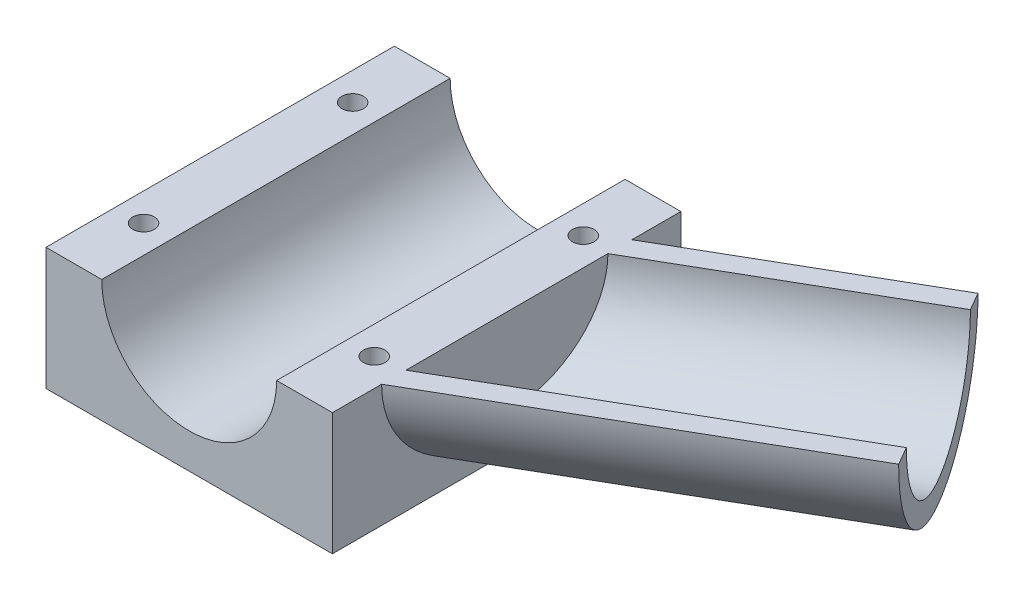
ISO-10303-21;
HEADER;
FILE_DESCRIPTION(('STEP AP214'),'2;1');
FILE_NAME('part.step','',(''),(''),'','','');
FILE_SCHEMA(('AUTOMOTIVE_DESIGN { 1 0 10303 214 1 1 1 1 }'));
ENDSEC;
DATA;
#1=APPLICATION_CONTEXT('core data for automotive mechanical design processes');
#2=APPLICATION_PROTOCOL_DEFINITION('international standard','automotive_design',2000,#1);
#3=PRODUCT_CONTEXT('',#1,'mechanical');
#4=PRODUCT('Part','Part','',(#3));
#5=PRODUCT_RELATED_PRODUCT_CATEGORY('part','',(#4));
#6=PRODUCT_DEFINITION_FORMATION('','',#4);
#7=PRODUCT_DEFINITION_CONTEXT('part definition',#1,'design');
#8=PRODUCT_DEFINITION('design','',#6,#7);
#9=PRODUCT_DEFINITION_SHAPE('','',#8);
#10=(LENGTH_UNIT() NAMED_UNIT(*) SI_UNIT(.MILLI.,.METRE.));
#11=(NAMED_UNIT(*) PLANE_ANGLE_UNIT() SI_UNIT($,.RADIAN.));
#12=(NAMED_UNIT(*) SI_UNIT($,.STERADIAN.) SOLID_ANGLE_UNIT());
#13=UNCERTAINTY_MEASURE_WITH_UNIT(LENGTH_MEASURE(1.E-05),#10,'distance_accuracy_value','');
#14=(GEOMETRIC_REPRESENTATION_CONTEXT(3) GLOBAL_UNCERTAINTY_ASSIGNED_CONTEXT((#13)) GLOBAL_UNIT_ASSIGNED_CONTEXT((#10,
#11,#12)) REPRESENTATION_CONTEXT('',''));
#15=CARTESIAN_POINT('',(0.,0.,0.));
#16=DIRECTION('',(0.,0.,1.));
#17=DIRECTION('',(1.,0.,0.));
#18=AXIS2_PLACEMENT_3D('',#15,#16,#17);
#19=CARTESIAN_POINT('',(20.55,0.,25.));
#20=DIRECTION('',(-1.,0.,0.));
#21=DIRECTION('',(0.,0.,1.));
#22=AXIS2_PLACEMENT_3D('',#19,#20,#21);
#23=PLANE('',#22);
#24=CARTESIAN_POINT('',(20.55,17.55,-0.0231214501151579));
#25=DIRECTION('',(-1.,0.,0.));
#26=DIRECTION('',(0.,0.,-1.));
#27=AXIS2_PLACEMENT_3D('',#24,#25,#26);
#28=ELLIPSE('',#27,17.9555933717974,15.55);
#29=CARTESIAN_POINT('',(20.55,17.55,17.9324719216822));
#30=VERTEX_POINT('',#29);
#31=CARTESIAN_POINT('',(20.55,17.55,-17.9787148219125));
#32=VERTEX_POINT('',#31);
#33=EDGE_CURVE('E137',#30,#32,#28,.F.);
#34=ORIENTED_EDGE('',*,*,#33,.F.);
#35=DIRECTION('',(0.,0.,-1.));
#36=VECTOR('',#35,1.);
#37=CARTESIAN_POINT('',(20.55,17.55,25.));
#38=LINE('',#37,#36);
#39=CARTESIAN_POINT('',(20.55,17.55,25.));
#40=VERTEX_POINT('',#39);
#41=EDGE_CURVE('E123',#40,#30,#38,.T.);
#42=ORIENTED_EDGE('',*,*,#41,.F.);
#43=DIRECTION('',(0.,1.,0.));
#44=VECTOR('',#43,1.);
#45=CARTESIAN_POINT('',(20.55,0.,25.));
#46=LINE('',#45,#44);
#47=CARTESIAN_POINT('',(20.55,0.,25.));
#48=VERTEX_POINT('',#47);
#49=EDGE_CURVE('E191',#48,#40,#46,.T.);
#50=ORIENTED_EDGE('',*,*,#49,.F.);
#51=DIRECTION('',(0.,0.,-1.));
#52=VECTOR('',#51,1.);
#53=CARTESIAN_POINT('',(20.55,0.,25.));
#54=LINE('',#53,#52);
#55=CARTESIAN_POINT('',(20.55,0.,-25.));
#56=VERTEX_POINT('',#55);
#57=EDGE_CURVE('E215',#48,#56,#54,.T.);
#58=ORIENTED_EDGE('',*,*,#57,.T.);
#59=DIRECTION('',(0.,1.,0.));
#60=VECTOR('',#59,1.);
#61=CARTESIAN_POINT('',(20.55,0.,-25.));
#62=LINE('',#61,#60);
#63=CARTESIAN_POINT('',(20.55,17.55,-25.));
#64=VERTEX_POINT('',#63);
#65=EDGE_CURVE('E204',#56,#64,#62,.T.);
#66=ORIENTED_EDGE('',*,*,#65,.T.);
#67=EDGE_CURVE('E58',#32,#64,#38,.T.);
#68=ORIENTED_EDGE('',*,*,#67,.F.);
#69=EDGE_LOOP('',(#34,#42,#50,#58,#66,#68));
#70=FACE_BOUND('',#69,.T.);
#71=ADVANCED_FACE('F37',(#70),#23,.F.);
#72=CARTESIAN_POINT('',(20.55,17.55,-0.0459838096834794));
#73=DIRECTION('',(-1.,0.,0.));
#74=DIRECTION('',(0.,0.,-1.));
#75=AXIS2_PLACEMENT_3D('',#72,#73,#74);
#76=ELLIPSE('',#75,14.4914917566596,12.55);
#77=CARTESIAN_POINT('',(20.55,17.55,-14.5374755663431));
#78=VERTEX_POINT('',#77);
#79=CARTESIAN_POINT('',(20.55,17.55,14.4455079469761));
#80=VERTEX_POINT('',#79);
#81=EDGE_CURVE('E65',#78,#80,#76,.T.);
#82=ORIENTED_EDGE('',*,*,#81,.F.);
#83=EDGE_CURVE('E117',#80,#78,#38,.T.);
#84=ORIENTED_EDGE('',*,*,#83,.F.);
#85=EDGE_LOOP('',(#82,#84));
#86=FACE_BOUND('',#85,.T.);
#87=ADVANCED_FACE('F119',(#86),#23,.F.);
#88=CARTESIAN_POINT('',(-20.55,17.55,25.));
#89=DIRECTION('',(0.,-1.,0.));
#90=DIRECTION('',(0.,0.,-1.));
#91=AXIS2_PLACEMENT_3D('',#88,#89,#90);
#92=PLANE('',#91);
#93=CARTESIAN_POINT('',(-16.55,17.55,15.));
#94=DIRECTION('',(0.,1.,0.));
#95=DIRECTION('',(0.,0.,1.));
#96=AXIS2_PLACEMENT_3D('',#93,#94,#95);
#97=CIRCLE('',#96,1.55);
#98=CARTESIAN_POINT('',(-16.55,17.55,16.55));
#99=VERTEX_POINT('',#98);
#100=EDGE_CURVE('E158',#99,#99,#97,.T.);
#101=ORIENTED_EDGE('',*,*,#100,.F.);
#102=EDGE_LOOP('',(#101));
#103=FACE_BOUND('',#102,.T.);
#104=CARTESIAN_POINT('',(-16.55,17.55,-15.));
#105=DIRECTION('',(0.,1.,0.));
#106=DIRECTION('',(0.,0.,1.));
#107=AXIS2_PLACEMENT_3D('',#104,#105,#106);
#108=CIRCLE('',#107,1.55);
#109=CARTESIAN_POINT('',(-16.55,17.55,-13.45));
#110=VERTEX_POINT('',#109);
#111=EDGE_CURVE('E166',#110,#110,#108,.T.);
#112=ORIENTED_EDGE('',*,*,#111,.F.);
#113=EDGE_LOOP('',(#112));
#114=FACE_BOUND('',#113,.T.);
#115=DIRECTION('',(-1.,0.,0.));
#116=VECTOR('',#115,1.);
#117=CARTESIAN_POINT('',(-20.55,17.55,-25.));
#118=LINE('',#117,#116);
#119=CARTESIAN_POINT('',(-12.55,17.55,-25.));
#120=VERTEX_POINT('',#119);
#121=CARTESIAN_POINT('',(-20.55,17.55,-25.));
#122=VERTEX_POINT('',#121);
#123=EDGE_CURVE('E182',#120,#122,#118,.T.);
#124=ORIENTED_EDGE('',*,*,#123,.T.);
#125=DIRECTION('',(0.,0.,-1.));
#126=VECTOR('',#125,1.);
#127=CARTESIAN_POINT('',(-20.55,17.55,25.));
#128=LINE('',#127,#126);
#129=CARTESIAN_POINT('',(-20.55,17.55,25.));
#130=VERTEX_POINT('',#129);
#131=EDGE_CURVE('E11',#130,#122,#128,.T.);
#132=ORIENTED_EDGE('',*,*,#131,.F.);
#133=DIRECTION('',(-1.,0.,0.));
#134=VECTOR('',#133,1.);
#135=CARTESIAN_POINT('',(-20.55,17.55,25.));
#136=LINE('',#135,#134);
#137=CARTESIAN_POINT('',(-12.55,17.55,25.));
#138=VERTEX_POINT('',#137);
#139=EDGE_CURVE('E183',#138,#130,#136,.T.);
#140=ORIENTED_EDGE('',*,*,#139,.F.);
#141=DIRECTION('',(0.,0.,-1.));
#142=VECTOR('',#141,1.);
#143=CARTESIAN_POINT('',(-12.55,17.55,25.));
#144=LINE('',#143,#142);
#145=EDGE_CURVE('E197',#138,#120,#144,.T.);
#146=ORIENTED_EDGE('',*,*,#145,.T.);
#147=EDGE_LOOP('',(#124,#132,#140,#146));
#148=FACE_BOUND('',#147,.T.);
#149=ADVANCED_FACE('F39',(#103,#114,#148),#92,.F.);
#150=CARTESIAN_POINT('',(-20.55,17.55,25.));
#151=DIRECTION('',(1.,0.,0.));
#152=DIRECTION('',(0.,0.,-1.));
#153=AXIS2_PLACEMENT_3D('',#150,#151,#152);
#154=PLANE('',#153);
#155=DIRECTION('',(0.,-1.,0.));
#156=VECTOR('',#155,1.);
#157=CARTESIAN_POINT('',(-20.55,17.55,-25.));
#158=LINE('',#157,#156);
#159=CARTESIAN_POINT('',(-20.55,0.,-25.));
#160=VERTEX_POINT('',#159);
#161=EDGE_CURVE('E200',#122,#160,#158,.T.);
#162=ORIENTED_EDGE('',*,*,#161,.T.);
#163=DIRECTION('',(0.,0.,-1.));
#164=VECTOR('',#163,1.);
#165=CARTESIAN_POINT('',(-20.55,0.,25.));
#166=LINE('',#165,#164);
#167=CARTESIAN_POINT('',(-20.55,0.,25.));
#168=VERTEX_POINT('',#167);
#169=EDGE_CURVE('E51',#168,#160,#166,.T.);
#170=ORIENTED_EDGE('',*,*,#169,.F.);
#171=DIRECTION('',(0.,-1.,0.));
#172=VECTOR('',#171,1.);
#173=CARTESIAN_POINT('',(-20.55,17.55,25.));
#174=LINE('',#173,#172);
#175=EDGE_CURVE('E186',#130,#168,#174,.T.);
#176=ORIENTED_EDGE('',*,*,#175,.F.);
#177=ORIENTED_EDGE('',*,*,#131,.T.);
#178=EDGE_LOOP('',(#162,#170,#176,#177));
#179=FACE_BOUND('',#178,.T.);
#180=ADVANCED_FACE('F240',(#179),#154,.F.);
#181=CARTESIAN_POINT('',(-20.55,0.,25.));
#182=DIRECTION('',(0.,1.,0.));
#183=DIRECTION('',(0.,0.,1.));
#184=AXIS2_PLACEMENT_3D('',#181,#182,#183);
#185=PLANE('',#184);
#186=CARTESIAN_POINT('',(-16.55,0.,15.));
#187=DIRECTION('',(0.,1.,0.));
#188=DIRECTION('',(0.,0.,1.));
#189=AXIS2_PLACEMENT_3D('',#186,#187,#188);
#190=CIRCLE('',#189,1.55);
#191=CARTESIAN_POINT('',(-16.55,0.,16.55));
#192=VERTEX_POINT('',#191);
#193=EDGE_CURVE('E170',#192,#192,#190,.F.);
#194=ORIENTED_EDGE('',*,*,#193,.F.);
#195=EDGE_LOOP('',(#194));
#196=FACE_BOUND('',#195,.T.);
#197=CARTESIAN_POINT('',(16.55,0.,15.));
#198=DIRECTION('',(0.,1.,0.));
#199=DIRECTION('',(0.,0.,1.));
#200=AXIS2_PLACEMENT_3D('',#197,#198,#199);
#201=CIRCLE('',#200,1.55);
#202=CARTESIAN_POINT('',(16.55,0.,16.55));
#203=VERTEX_POINT('',#202);
#204=EDGE_CURVE('E163',#203,#203,#201,.F.);
#205=ORIENTED_EDGE('',*,*,#204,.F.);
#206=EDGE_LOOP('',(#205));
#207=FACE_BOUND('',#206,.T.);
#208=CARTESIAN_POINT('',(16.55,0.,-15.));
#209=DIRECTION('',(0.,1.,0.));
#210=DIRECTION('',(0.,0.,1.));
#211=AXIS2_PLACEMENT_3D('',#208,#209,#210);
#212=CIRCLE('',#211,1.55);
#213=CARTESIAN_POINT('',(16.55,0.,-13.45));
#214=VERTEX_POINT('',#213);
#215=EDGE_CURVE('E162',#214,#214,#212,.F.);
#216=ORIENTED_EDGE('',*,*,#215,.F.);
#217=EDGE_LOOP('',(#216));
#218=FACE_BOUND('',#217,.T.);
#219=CARTESIAN_POINT('',(-16.55,0.,-15.));
#220=DIRECTION('',(0.,1.,0.));
#221=DIRECTION('',(0.,0.,1.));
#222=AXIS2_PLACEMENT_3D('',#219,#220,#221);
#223=CIRCLE('',#222,1.55);
#224=CARTESIAN_POINT('',(-16.55,0.,-13.45));
#225=VERTEX_POINT('',#224);
#226=EDGE_CURVE('E179',#225,#225,#223,.F.);
#227=ORIENTED_EDGE('',*,*,#226,.F.);
#228=EDGE_LOOP('',(#227));
#229=FACE_BOUND('',#228,.T.);
#230=DIRECTION('',(1.,0.,0.));
#231=VECTOR('',#230,1.);
#232=CARTESIAN_POINT('',(-20.55,0.,-25.));
#233=LINE('',#232,#231);
#234=EDGE_CURVE('E202',#160,#56,#233,.T.);
#235=ORIENTED_EDGE('',*,*,#234,.T.);
#236=ORIENTED_EDGE('',*,*,#57,.F.);
#237=DIRECTION('',(1.,0.,0.));
#238=VECTOR('',#237,1.);
#239=CARTESIAN_POINT('',(-20.55,0.,25.));
#240=LINE('',#239,#238);
#241=EDGE_CURVE('E189',#168,#48,#240,.T.);
#242=ORIENTED_EDGE('',*,*,#241,.F.);
#243=ORIENTED_EDGE('',*,*,#169,.T.);
#244=EDGE_LOOP('',(#235,#236,#242,#243));
#245=FACE_BOUND('',#244,.T.);
#246=ADVANCED_FACE('F223',(#196,#207,#218,#229,#245),#185,.F.);
#247=CARTESIAN_POINT('',(20.55,17.55,25.));
#248=DIRECTION('',(0.,-1.,0.));
#249=DIRECTION('',(0.,0.,-1.));
#250=AXIS2_PLACEMENT_3D('',#247,#248,#249);
#251=PLANE('',#250);
#252=CARTESIAN_POINT('',(16.55,17.55,15.));
#253=DIRECTION('',(0.,1.,0.));
#254=DIRECTION('',(0.,0.,1.));
#255=AXIS2_PLACEMENT_3D('',#252,#253,#254);
#256=CIRCLE('',#255,1.55);
#257=CARTESIAN_POINT('',(16.55,17.55,16.55));
#258=VERTEX_POINT('',#257);
#259=EDGE_CURVE('E167',#258,#258,#256,.T.);
#260=ORIENTED_EDGE('',*,*,#259,.F.);
#261=EDGE_LOOP('',(#260));
#262=FACE_BOUND('',#261,.T.);
#263=CARTESIAN_POINT('',(16.55,17.55,-15.));
#264=DIRECTION('',(0.,1.,0.));
#265=DIRECTION('',(0.,0.,1.));
#266=AXIS2_PLACEMENT_3D('',#263,#264,#265);
#267=CIRCLE('',#266,1.55);
#268=CARTESIAN_POINT('',(16.55,17.55,-13.45));
#269=VERTEX_POINT('',#268);
#270=EDGE_CURVE('E159',#269,#269,#267,.T.);
#271=ORIENTED_EDGE('',*,*,#270,.F.);
#272=EDGE_LOOP('',(#271));
#273=FACE_BOUND('',#272,.T.);
#274=DIRECTION('',(-1.,0.,0.));
#275=VECTOR('',#274,1.);
#276=CARTESIAN_POINT('',(20.55,17.55,-25.));
#277=LINE('',#276,#275);
#278=CARTESIAN_POINT('',(12.55,17.55,-25.));
#279=VERTEX_POINT('',#278);
#280=EDGE_CURVE('E206',#64,#279,#277,.T.);
#281=ORIENTED_EDGE('',*,*,#280,.T.);
#282=DIRECTION('',(0.,0.,-1.));
#283=VECTOR('',#282,1.);
#284=CARTESIAN_POINT('',(12.55,17.55,25.));
#285=LINE('',#284,#283);
#286=CARTESIAN_POINT('',(12.55,17.55,25.));
#287=VERTEX_POINT('',#286);
#288=EDGE_CURVE('E211',#287,#279,#285,.T.);
#289=ORIENTED_EDGE('',*,*,#288,.F.);
#290=DIRECTION('',(-1.,0.,0.));
#291=VECTOR('',#290,1.);
#292=CARTESIAN_POINT('',(20.55,17.55,25.));
#293=LINE('',#292,#291);
#294=EDGE_CURVE('E193',#40,#287,#293,.T.);
#295=ORIENTED_EDGE('',*,*,#294,.F.);
#296=ORIENTED_EDGE('',*,*,#41,.T.);
#297=DIRECTION('',(-0.866025403784438,0.,0.500000000000002));
#298=VECTOR('',#297,1.);
#299=CARTESIAN_POINT('',(67.5873334212851,17.55,-9.22454519105902));
#300=LINE('',#299,#298);
#301=CARTESIAN_POINT('',(67.5873334212851,17.55,-9.22454519105902));
#302=VERTEX_POINT('',#301);
#303=EDGE_CURVE('E134',#302,#30,#300,.T.);
#304=ORIENTED_EDGE('',*,*,#303,.F.);
#305=DIRECTION('',(0.500000000000003,0.,0.866025403784437));
#306=VECTOR('',#305,1.);
#307=CARTESIAN_POINT('',(67.5873334212851,17.55,-9.22454519105902));
#308=LINE('',#307,#306);
#309=CARTESIAN_POINT('',(66.0774337291968,17.55,-11.8397681720886));
#310=VERTEX_POINT('',#309);
#311=EDGE_CURVE('E130',#310,#302,#308,.T.);
#312=ORIENTED_EDGE('',*,*,#311,.F.);
#313=DIRECTION('',(-0.866025403784438,0.,0.500000000000002));
#314=VECTOR('',#313,1.);
#315=CARTESIAN_POINT('',(66.0774337291968,17.55,-11.8397681720886));
#316=LINE('',#315,#314);
#317=EDGE_CURVE('E127',#310,#80,#316,.T.);
#318=ORIENTED_EDGE('',*,*,#317,.T.);
#319=ORIENTED_EDGE('',*,*,#83,.T.);
#320=DIRECTION('',(-0.866025403784438,0.,0.500000000000002));
#321=VECTOR('',#320,1.);
#322=CARTESIAN_POINT('',(53.5274337291967,17.55,-33.577005807078));
#323=LINE('',#322,#321);
#324=CARTESIAN_POINT('',(53.5274337291967,17.55,-33.577005807078));
#325=VERTEX_POINT('',#324);
#326=EDGE_CURVE('E133',#325,#78,#323,.T.);
#327=ORIENTED_EDGE('',*,*,#326,.F.);
#328=DIRECTION('',(0.500000000000002,0.,0.866025403784438));
#329=VECTOR('',#328,1.);
#330=CARTESIAN_POINT('',(53.5274337291967,17.55,-33.577005807078));
#331=LINE('',#330,#329);
#332=CARTESIAN_POINT('',(52.037333421285,17.55,-36.157935248755));
#333=VERTEX_POINT('',#332);
#334=EDGE_CURVE('E148',#333,#325,#331,.T.);
#335=ORIENTED_EDGE('',*,*,#334,.F.);
#336=DIRECTION('',(-0.866025403784438,0.,0.500000000000002));
#337=VECTOR('',#336,1.);
#338=CARTESIAN_POINT('',(52.037333421285,17.55,-36.157935248755));
#339=LINE('',#338,#337);
#340=EDGE_CURVE('E156',#333,#32,#339,.T.);
#341=ORIENTED_EDGE('',*,*,#340,.T.);
#342=ORIENTED_EDGE('',*,*,#67,.T.);
#343=EDGE_LOOP('',(#281,#289,#295,#296,#304,#312,#318,#319,#327,#335,#341,#342));
#344=FACE_BOUND('',#343,.T.);
#345=ADVANCED_FACE('F128',(#262,#273,#344),#251,.F.);
#346=CARTESIAN_POINT('',(0.,17.55,25.));
#347=DIRECTION('',(0.,0.,-1.));
#348=DIRECTION('',(-1.,0.,0.));
#349=AXIS2_PLACEMENT_3D('',#346,#347,#348);
#350=CYLINDRICAL_SURFACE('',#349,12.55);
#351=CARTESIAN_POINT('',(0.,17.55,-25.));
#352=DIRECTION('',(0.,0.,-1.));
#353=DIRECTION('',(1.,0.,0.));
#354=AXIS2_PLACEMENT_3D('',#351,#352,#353);
#355=CIRCLE('',#354,12.55);
#356=EDGE_CURVE('E187',#279,#120,#355,.T.);
#357=ORIENTED_EDGE('',*,*,#356,.T.);
#358=ORIENTED_EDGE('',*,*,#145,.F.);
#359=CARTESIAN_POINT('',(0.,17.55,25.));
#360=DIRECTION('',(0.,0.,-1.));
#361=DIRECTION('',(1.,0.,0.));
#362=AXIS2_PLACEMENT_3D('',#359,#360,#361);
#363=CIRCLE('',#362,12.55);
#364=EDGE_CURVE('E195',#287,#138,#363,.T.);
#365=ORIENTED_EDGE('',*,*,#364,.F.);
#366=ORIENTED_EDGE('',*,*,#288,.T.);
#367=EDGE_LOOP('',(#357,#358,#365,#366));
#368=FACE_BOUND('',#367,.T.);
#369=ADVANCED_FACE('F244',(#368),#350,.F.);
#370=CARTESIAN_POINT('',(0.,17.55,25.));
#371=DIRECTION('',(0.,0.,1.));
#372=DIRECTION('',(1.,0.,0.));
#373=AXIS2_PLACEMENT_3D('',#370,#371,#372);
#374=PLANE('',#373);
#375=ORIENTED_EDGE('',*,*,#139,.T.);
#376=ORIENTED_EDGE('',*,*,#175,.T.);
#377=ORIENTED_EDGE('',*,*,#241,.T.);
#378=ORIENTED_EDGE('',*,*,#49,.T.);
#379=ORIENTED_EDGE('',*,*,#294,.T.);
#380=ORIENTED_EDGE('',*,*,#364,.T.);
#381=EDGE_LOOP('',(#375,#376,#377,#378,#379,#380));
#382=FACE_BOUND('',#381,.T.);
#383=ADVANCED_FACE('F236',(#382),#374,.T.);
#384=CARTESIAN_POINT('',(0.,17.55,-25.));
#385=DIRECTION('',(0.,0.,1.));
#386=DIRECTION('',(1.,0.,0.));
#387=AXIS2_PLACEMENT_3D('',#384,#385,#386);
#388=PLANE('',#387);
#389=ORIENTED_EDGE('',*,*,#123,.F.);
#390=ORIENTED_EDGE('',*,*,#356,.F.);
#391=ORIENTED_EDGE('',*,*,#280,.F.);
#392=ORIENTED_EDGE('',*,*,#65,.F.);
#393=ORIENTED_EDGE('',*,*,#234,.F.);
#394=ORIENTED_EDGE('',*,*,#161,.F.);
#395=EDGE_LOOP('',(#389,#390,#391,#392,#393,#394));
#396=FACE_BOUND('',#395,.T.);
#397=ADVANCED_FACE('F229',(#396),#388,.F.);
#398=CARTESIAN_POINT('',(16.55,-4.38406204335659,-15.));
#399=DIRECTION('',(0.,1.,0.));
#400=DIRECTION('',(0.,0.,1.));
#401=AXIS2_PLACEMENT_3D('',#398,#399,#400);
#402=CYLINDRICAL_SURFACE('',#401,1.55);
#403=ORIENTED_EDGE('',*,*,#215,.T.);
#404=EDGE_LOOP('',(#403));
#405=FACE_BOUND('',#404,.T.);
#406=ORIENTED_EDGE('',*,*,#270,.T.);
#407=EDGE_LOOP('',(#406));
#408=FACE_BOUND('',#407,.T.);
#409=ADVANCED_FACE('F295',(#405,#408),#402,.F.);
#410=CARTESIAN_POINT('',(16.55,-4.38406204335659,15.));
#411=DIRECTION('',(0.,1.,0.));
#412=DIRECTION('',(0.,0.,1.));
#413=AXIS2_PLACEMENT_3D('',#410,#411,#412);
#414=CYLINDRICAL_SURFACE('',#413,1.55);
#415=ORIENTED_EDGE('',*,*,#204,.T.);
#416=EDGE_LOOP('',(#415));
#417=FACE_BOUND('',#416,.T.);
#418=ORIENTED_EDGE('',*,*,#259,.T.);
#419=EDGE_LOOP('',(#418));
#420=FACE_BOUND('',#419,.T.);
#421=ADVANCED_FACE('F286',(#417,#420),#414,.F.);
#422=CARTESIAN_POINT('',(-16.55,-4.38406204335659,-15.));
#423=DIRECTION('',(0.,1.,0.));
#424=DIRECTION('',(0.,0.,1.));
#425=AXIS2_PLACEMENT_3D('',#422,#423,#424);
#426=CYLINDRICAL_SURFACE('',#425,1.55);
#427=ORIENTED_EDGE('',*,*,#226,.T.);
#428=EDGE_LOOP('',(#427));
#429=FACE_BOUND('',#428,.T.);
#430=ORIENTED_EDGE('',*,*,#111,.T.);
#431=EDGE_LOOP('',(#430));
#432=FACE_BOUND('',#431,.T.);
#433=ADVANCED_FACE('F283',(#429,#432),#426,.F.);
#434=CARTESIAN_POINT('',(-16.55,-4.38406204335659,15.));
#435=DIRECTION('',(0.,1.,0.));
#436=DIRECTION('',(0.,0.,1.));
#437=AXIS2_PLACEMENT_3D('',#434,#435,#436);
#438=CYLINDRICAL_SURFACE('',#437,1.55);
#439=ORIENTED_EDGE('',*,*,#193,.T.);
#440=EDGE_LOOP('',(#439));
#441=FACE_BOUND('',#440,.T.);
#442=ORIENTED_EDGE('',*,*,#100,.T.);
#443=EDGE_LOOP('',(#442));
#444=FACE_BOUND('',#443,.T.);
#445=ADVANCED_FACE('F285',(#441,#444),#438,.F.);
#446=CARTESIAN_POINT('',(59.8123334212851,17.55,-22.691240219907));
#447=DIRECTION('',(-0.866025403784438,0.,0.500000000000002));
#448=DIRECTION('',(0.500000000000002,0.,0.866025403784438));
#449=AXIS2_PLACEMENT_3D('',#446,#447,#448);
#450=CYLINDRICAL_SURFACE('',#449,15.55);
#451=CARTESIAN_POINT('',(45.2620526724303,2.02032537562642,-15.2083869895832));
#452=CARTESIAN_POINT('',(45.26205633923,2.02418920013468,-15.2955543585492));
#453=CARTESIAN_POINT('',(45.2694294611896,2.02842133952335,-15.3827638264494));
#454=CARTESIAN_POINT('',(45.2987275859641,2.03715527343421,-15.5547596411649));
#455=CARTESIAN_POINT('',(45.320669215916,2.04165737071416,-15.6395431037018));
#456=CARTESIAN_POINT('',(45.3784857389402,2.05042521763832,-15.8041998234869));
#457=CARTESIAN_POINT('',(45.4143547361554,2.05469106642138,-15.8840751419439));
#458=CARTESIAN_POINT('',(45.4990163959288,2.06251023798173,-16.0366669312086));
#459=CARTESIAN_POINT('',(45.5478058215561,2.066063738831,-16.1093851888114));
#460=CARTESIAN_POINT('',(45.6568844393027,2.07205617181064,-16.2455401418695));
#461=CARTESIAN_POINT('',(45.7171611900976,2.07449630016045,-16.3089867488132));
#462=CARTESIAN_POINT('',(45.8475424392882,2.07799123976775,-16.4248682764751));
#463=CARTESIAN_POINT('',(45.9176470023308,2.07904604191214,-16.4773031247528));
#464=CARTESIAN_POINT('',(46.0653353110408,2.07964892079179,-16.5694357502168));
#465=CARTESIAN_POINT('',(46.1428833138642,2.07920387945623,-16.6091907899252));
#466=CARTESIAN_POINT('',(46.3035171885947,2.07687258795515,-16.6751625349934));
#467=CARTESIAN_POINT('',(46.3866030222516,2.07498634774313,-16.7013793338515));
#468=CARTESIAN_POINT('',(46.5558813807299,2.06998696111358,-16.7395297111124));
#469=CARTESIAN_POINT('',(46.6420712788488,2.0668748308818,-16.7514750866357));
#470=CARTESIAN_POINT('',(46.8151996037612,2.0597707701028,-16.7608063246381));
#471=CARTESIAN_POINT('',(46.9021380501555,2.0557788164495,-16.7581918046986));
#472=CARTESIAN_POINT('',(47.074698757268,2.04733923147732,-16.7384491596381));
#473=CARTESIAN_POINT('',(47.1603139774713,2.04288976107674,-16.7212602726879));
#474=CARTESIAN_POINT('',(47.3274559893531,2.03404225005765,-16.6727747667112));
#475=CARTESIAN_POINT('',(47.4089827009646,2.02964421044763,-16.6414778715214));
#476=CARTESIAN_POINT('',(47.5658740961401,2.02137355837333,-16.5655417185064));
#477=CARTESIAN_POINT('',(47.6412213007677,2.01750241717708,-16.5208661716332));
#478=CARTESIAN_POINT('',(47.7833581555217,2.01072812986431,-16.419455503554));
#479=CARTESIAN_POINT('',(47.8501479817816,2.00782496382234,-16.3627206306249));
#480=CARTESIAN_POINT('',(47.9730748860649,2.00331238887912,-16.2389748994778));
#481=CARTESIAN_POINT('',(48.0292420784958,2.0016992794708,-16.1719940947776));
#482=CARTESIAN_POINT('',(48.1295458582882,1.99992561866639,-16.0295443389379));
#483=CARTESIAN_POINT('',(48.1736827657671,1.99976502861614,-15.9540756137314));
#484=CARTESIAN_POINT('',(48.2485127476051,2.00090273252432,-15.7971239067418));
#485=CARTESIAN_POINT('',(48.2792584096193,2.00219524712129,-15.7156659462017));
#486=CARTESIAN_POINT('',(48.3266988728493,2.00607592957498,-15.5487866408029));
#487=CARTESIAN_POINT('',(48.3433935708379,2.00866410695022,-15.4633652668311));
#488=CARTESIAN_POINT('',(48.3622881240329,2.01484175945325,-15.2908805005466));
#489=CARTESIAN_POINT('',(48.3644727254458,2.01843228417331,-15.2038154767009));
#490=CARTESIAN_POINT('',(48.3542625937158,2.02620509148809,-15.0305706679314));
#491=CARTESIAN_POINT('',(48.3418674300385,2.03038739155448,-14.9443909092248));
#492=CARTESIAN_POINT('',(48.3027654905743,2.03888935083903,-14.7749496997556));
#493=CARTESIAN_POINT('',(48.2759964137134,2.04320953041959,-14.6917026467407));
#494=CARTESIAN_POINT('',(48.2088561168276,2.05147738253638,-14.5308663501793));
#495=CARTESIAN_POINT('',(48.1684848168053,2.05542505288163,-14.453277139911));
#496=CARTESIAN_POINT('',(48.0752240510177,2.0624996937119,-14.3058848858825));
#497=CARTESIAN_POINT('',(48.0223234207427,2.06562592696795,-14.2360888684919));
#498=CARTESIAN_POINT('',(47.9055145794632,2.07069280570708,-14.1063621240779));
#499=CARTESIAN_POINT('',(47.8416066738892,2.0726334840802,-14.0464311234095));
#500=CARTESIAN_POINT('',(47.7048766518706,2.07509973809678,-13.938375952648));
#501=CARTESIAN_POINT('',(47.6320909147884,2.07563089854094,-13.8902058748115));
#502=CARTESIAN_POINT('',(47.4794813779933,2.07523303172739,-13.8067441985018));
#503=CARTESIAN_POINT('',(47.3996577031549,2.07430403037247,-13.7714523715863));
#504=CARTESIAN_POINT('',(47.2354636518955,2.0710971040048,-13.7148188051653));
#505=CARTESIAN_POINT('',(47.1511054637703,2.06882264531954,-13.6934415135775));
#506=CARTESIAN_POINT('',(46.9800389004152,2.06318733953494,-13.6650794621736));
#507=CARTESIAN_POINT('',(46.8933304747999,2.05982646912766,-13.658095011166));
#508=CARTESIAN_POINT('',(46.719745327022,2.05238908084308,-13.6586985790262));
#509=CARTESIAN_POINT('',(46.6328688405295,2.04831052731975,-13.6663286761189));
#510=CARTESIAN_POINT('',(46.4616289582495,2.03990752430941,-13.6960196864783));
#511=CARTESIAN_POINT('',(46.3772656311442,2.03558306811148,-13.7180809937589));
#512=CARTESIAN_POINT('',(46.2130970745756,2.02716228400729,-13.7761296818276));
#513=CARTESIAN_POINT('',(46.1333104451991,2.02306688850128,-13.812169824805));
#514=CARTESIAN_POINT('',(45.9809060872675,2.01559098038745,-13.8971633379723));
#515=CARTESIAN_POINT('',(45.9082880433248,2.0122104363217,-13.9461161397115));
#516=CARTESIAN_POINT('',(45.7723816788033,2.00655750567297,-14.0554853831176));
#517=CARTESIAN_POINT('',(45.7090808382724,2.00428362235889,-14.1158861870651));
#518=CARTESIAN_POINT('',(45.5934973822479,2.00110266626072,-14.2464993646975));
#519=CARTESIAN_POINT('',(45.5412169151704,2.00019585977598,-14.3167136470862));
#520=CARTESIAN_POINT('',(45.4493789036508,1.99986195776657,-14.4646314383319));
#521=CARTESIAN_POINT('',(45.4097722280463,2.00042906845342,-14.5423044708651));
#522=CARTESIAN_POINT('',(45.3441577869512,2.00297682639485,-14.7031055164233));
#523=CARTESIAN_POINT('',(45.3181351356333,2.00495592069588,-14.786227445415));
#524=CARTESIAN_POINT('',(45.2868900545203,2.00921587656138,-14.9262414887749));
#525=CARTESIAN_POINT('',(45.2775869500217,2.0111559188965,-14.9822678532798));
#526=CARTESIAN_POINT('',(45.2651670686679,2.01545380240391,-15.0949858691935));
#527=CARTESIAN_POINT('',(45.2620502868786,2.01781164324297,-15.1516775200716));
#528=CARTESIAN_POINT('',(45.2620526724303,2.02032537562642,-15.2083869895832));
#529=B_SPLINE_CURVE_WITH_KNOTS('',3,(#451,#452,#453,#454,#455,#456,#457,#458,#459,#460,#461,
#462,#463,#464,#465,#466,#467,#468,#469,#470,#471,#472,#473,#474,#475,#476,#477,#478,#479,#480,
#481,#482,#483,#484,#485,#486,#487,#488,#489,#490,#491,#492,#493,#494,#495,#496,#497,#498,#499,
#500,#501,#502,#503,#504,#505,#506,#507,#508,#509,#510,#511,#512,#513,#514,#515,#516,#517,#518,
#519,#520,#521,#522,#523,#524,#525,#526,#527,#528),.UNSPECIFIED.,.T.,.F.,(4,2,2,2,2,2,2,2,2,2,2,
2,2,2,2,2,2,2,2,2,2,2,2,2,2,2,2,2,2,2,2,2,2,2,2,2,2,2,4),(0.,0.261552015165669,0.52340305571867,
0.785143367799772,1.04681816849996,1.30821115708327,1.56960586518008,1.82980281756388,
2.08999797294105,2.34997789525659,2.60996464602878,2.87104066457713,3.13212179389415,
3.39391761033022,3.65570803744858,3.91674480199317,4.17777461985573,4.43776991812374,
4.69776712646351,4.95803761464495,5.21831578869793,5.47973130577198,5.74114836030991,
6.00279923796598,6.26444285648673,6.5250482303022,6.78564898111388,7.04558124745135,
7.30551909076097,7.56620647258639,7.82690097223156,8.08858917445787,8.35026585837097,
8.61158764072427,8.87296032060531,9.1333071317301,9.39336804402122,9.56352905766541,
9.73368993559139),.UNSPECIFIED.);
#530=CARTESIAN_POINT('',(45.2620526724303,2.02032537562642,-15.2083869895832));
#531=VERTEX_POINT('',#530);
#532=EDGE_CURVE('E143',#531,#531,#529,.T.);
#533=ORIENTED_EDGE('',*,*,#532,.F.);
#534=EDGE_LOOP('',(#533));
#535=FACE_BOUND('',#534,.T.);
#536=ORIENTED_EDGE('',*,*,#303,.T.);
#537=ORIENTED_EDGE('',*,*,#33,.T.);
#538=ORIENTED_EDGE('',*,*,#340,.F.);
#539=CARTESIAN_POINT('',(59.8123334212851,17.55,-22.691240219907));
#540=DIRECTION('',(0.866025403784438,0.,-0.500000000000002));
#541=DIRECTION('',(-0.500000000000002,0.,-0.866025403784438));
#542=AXIS2_PLACEMENT_3D('',#539,#540,#541);
#543=CIRCLE('',#542,15.55);
#544=EDGE_CURVE('E140',#302,#333,#543,.T.);
#545=ORIENTED_EDGE('',*,*,#544,.F.);
#546=EDGE_LOOP('',(#536,#537,#538,#545));
#547=FACE_BOUND('',#546,.T.);
#548=ADVANCED_FACE('F249',(#535,#547),#450,.T.);
#549=CARTESIAN_POINT('',(59.8024337291967,17.55,-22.7083869895833));
#550=DIRECTION('',(-0.866025403784438,0.,0.500000000000002));
#551=DIRECTION('',(0.500000000000002,0.,0.866025403784438));
#552=AXIS2_PLACEMENT_3D('',#549,#550,#551);
#553=CYLINDRICAL_SURFACE('',#552,12.55);
#554=CARTESIAN_POINT('',(45.2620526724303,5.02395213964116,-15.2083869895832));
#555=CARTESIAN_POINT('',(45.2620562306795,5.02862588513992,-15.2956056025853));
#556=CARTESIAN_POINT('',(45.2694376721673,5.03376281884102,-15.3828553056006));
#557=CARTESIAN_POINT('',(45.2987620580694,5.04438757749893,-15.5549185786391));
#558=CARTESIAN_POINT('',(45.3207211643577,5.04987578579555,-15.6397293356619));
#559=CARTESIAN_POINT('',(45.3785841108097,5.06057877333543,-15.8044416243056));
#560=CARTESIAN_POINT('',(45.4144823737209,5.06579366099214,-15.8843451046064));
#561=CARTESIAN_POINT('',(45.4992219808785,5.07536023221266,-16.0369974081047));
#562=CARTESIAN_POINT('',(45.5480600797323,5.07971213174149,-16.109748019023));
#563=CARTESIAN_POINT('',(45.6572339688523,5.08705103095026,-16.2459307887705));
#564=CARTESIAN_POINT('',(45.7175513211033,5.09004019367019,-16.3093776059205));
#565=CARTESIAN_POINT('',(45.8480280380999,5.09431945210512,-16.4252554643872));
#566=CARTESIAN_POINT('',(45.9181873006532,5.09560956546055,-16.4776866200695));
#567=CARTESIAN_POINT('',(46.0658189150392,5.09633875538956,-16.5696909402348));
#568=CARTESIAN_POINT('',(46.1432376975621,5.09579049148098,-16.6093499895847));
#569=CARTESIAN_POINT('',(46.3035812013139,5.0929337998893,-16.6751751336146));
#570=CARTESIAN_POINT('',(46.3865058737668,5.09062538779724,-16.701341347808));
#571=CARTESIAN_POINT('',(46.5553982930167,5.08451539902752,-16.7394368580348));
#572=CARTESIAN_POINT('',(46.6413621279061,5.08071568249361,-16.7513838155523));
#573=CARTESIAN_POINT('',(46.8140256931061,5.07205096796909,-16.7607955324157));
#574=CARTESIAN_POINT('',(46.9007254528085,5.0671859272364,-16.7582597105928));
#575=CARTESIAN_POINT('',(47.0730049020705,5.05690046123178,-16.7387354696722));
#576=CARTESIAN_POINT('',(47.158574076864,5.05147672628877,-16.7216559877165));
#577=CARTESIAN_POINT('',(47.3256497986765,5.04070685372135,-16.6734054378192));
#578=CARTESIAN_POINT('',(47.4071562293868,5.03536071832157,-16.6422339667075));
#579=CARTESIAN_POINT('',(47.5641482097429,5.02532260928598,-16.566502533584));
#580=CARTESIAN_POINT('',(47.6396080929717,5.02063336694709,-16.5218889677444));
#581=CARTESIAN_POINT('',(47.7819854515185,5.01246363037328,-16.4205604007453));
#582=CARTESIAN_POINT('',(47.8489031994974,5.00898309755081,-16.3638457860001));
#583=CARTESIAN_POINT('',(47.9719886784379,5.0036366391157,-16.2401933988949));
#584=CARTESIAN_POINT('',(48.0282028934171,5.00176360185631,-16.173302212654));
#585=CARTESIAN_POINT('',(48.1286219194411,4.99981725935061,-16.0310209536608));
#586=CARTESIAN_POINT('',(48.1728272122494,4.99974388189656,-15.9556312220176));
#587=CARTESIAN_POINT('',(48.2477334875783,5.00139989230297,-15.7989909210668));
#588=CARTESIAN_POINT('',(48.278513261963,5.00311855544731,-15.7177778959547));
#589=CARTESIAN_POINT('',(48.3260955357483,5.00815033819041,-15.551403947766));
#590=CARTESIAN_POINT('',(48.3428978689338,5.01146347674938,-15.4662429777544));
#591=CARTESIAN_POINT('',(48.362096615257,5.01932342575854,-15.2942200107288));
#592=CARTESIAN_POINT('',(48.3644678242401,5.02387238011626,-15.2073553033171));
#593=CARTESIAN_POINT('',(48.3546979007977,5.03369740247235,-15.0344865658041));
#594=CARTESIAN_POINT('',(48.3425561079401,5.03897350355076,-14.9484825750504));
#595=CARTESIAN_POINT('',(48.3039768144937,5.04970552155195,-14.7791383906025));
#596=CARTESIAN_POINT('',(48.2774432192928,5.05516241300512,-14.69582013719));
#597=CARTESIAN_POINT('',(48.2107540032032,5.06560850167963,-14.5347929268964));
#598=CARTESIAN_POINT('',(48.1705982528853,5.07059769445661,-14.4570840233204));
#599=CARTESIAN_POINT('',(48.0777099513575,5.07954945249466,-14.3093689672875));
#600=CARTESIAN_POINT('',(48.0249604889864,5.08351062224329,-14.2393733587634));
#601=CARTESIAN_POINT('',(47.9083941675875,5.08994271635595,-14.109220837013));
#602=CARTESIAN_POINT('',(47.8445778011243,5.09241370702277,-14.0490634861381));
#603=CARTESIAN_POINT('',(47.70812847149,5.09556962455155,-13.9406755204393));
#604=CARTESIAN_POINT('',(47.6355531277957,5.09626562197348,-13.8923726867717));
#605=CARTESIAN_POINT('',(47.4833474978984,5.0958236689966,-13.8085980836888));
#606=CARTESIAN_POINT('',(47.403717405678,5.0946857690092,-13.7731259616071));
#607=CARTESIAN_POINT('',(47.2400220408549,5.09071518345367,-13.7161326170163));
#608=CARTESIAN_POINT('',(47.1559762742663,5.0878894600051,-13.6945548372305));
#609=CARTESIAN_POINT('',(46.9855207535789,5.08086910406365,-13.6657005592316));
#610=CARTESIAN_POINT('',(46.8991109244454,5.07667442807425,-13.6584245154872));
#611=CARTESIAN_POINT('',(46.7259478737368,5.06736555043465,-13.6583495860293));
#612=CARTESIAN_POINT('',(46.6391948462531,5.0622473171664,-13.6656156435348));
#613=CARTESIAN_POINT('',(46.4681401156552,5.05167704435951,-13.6945346474172));
#614=CARTESIAN_POINT('',(46.3838385160979,5.04622499074922,-13.7161882006541));
#615=CARTESIAN_POINT('',(46.2195219866855,5.03556134690064,-13.7734574520401));
#616=CARTESIAN_POINT('',(46.1395362359559,5.03035142021361,-13.8091572391822));
#617=CARTESIAN_POINT('',(45.9866693980186,5.02079382969938,-13.8935245425488));
#618=CARTESIAN_POINT('',(45.913787990277,5.01644612696118,-13.9421914733513));
#619=CARTESIAN_POINT('',(45.7773353179898,5.00910959983394,-14.0510354211277));
#620=CARTESIAN_POINT('',(45.7137472594786,5.00611830318681,-14.1111912110475));
#621=CARTESIAN_POINT('',(45.5975501247391,5.00182061113483,-14.2413833260007));
#622=CARTESIAN_POINT('',(45.5449428700771,5.00051449509264,-14.3114212871273));
#623=CARTESIAN_POINT('',(45.4525466871866,4.9997379937178,-14.4588747032595));
#624=CARTESIAN_POINT('',(45.412678552127,5.00025601438464,-14.5362405335314));
#625=CARTESIAN_POINT('',(45.3464699514407,5.00304468867727,-14.6964632108894));
#626=CARTESIAN_POINT('',(45.3201153912128,5.0053135100111,-14.7793142346528));
#627=CARTESIAN_POINT('',(45.2879695643847,5.01034476129735,-14.920221730836));
#628=CARTESIAN_POINT('',(45.278261725609,5.01269678704527,-14.9774313408132));
#629=CARTESIAN_POINT('',(45.2653020981554,5.01794848917555,-15.0925517261263));
#630=CARTESIAN_POINT('',(45.2620503092906,5.02084816554205,-15.1504625014418));
#631=CARTESIAN_POINT('',(45.2620526724303,5.02395213964116,-15.2083869895832));
#632=B_SPLINE_CURVE_WITH_KNOTS('',3,(#554,#555,#556,#557,#558,#559,#560,#561,#562,#563,#564,
#565,#566,#567,#568,#569,#570,#571,#572,#573,#574,#575,#576,#577,#578,#579,#580,#581,#582,#583,
#584,#585,#586,#587,#588,#589,#590,#591,#592,#593,#594,#595,#596,#597,#598,#599,#600,#601,#602,
#603,#604,#605,#606,#607,#608,#609,#610,#611,#612,#613,#614,#615,#616,#617,#618,#619,#620,#621,
#622,#623,#624,#625,#626,#627,#628,#629,#630,#631),.UNSPECIFIED.,.T.,.F.,(4,2,2,2,2,2,2,2,2,2,2,
2,2,2,2,2,2,2,2,2,2,2,2,2,2,2,2,2,2,2,2,2,2,2,2,2,2,2,4),(0.,0.26181995864289,0.523930676053048,
0.785936627166148,1.04787692763069,1.30939999633542,1.57092034974789,1.83064351847476,
2.09036438665188,2.34976232240677,2.60917066742304,2.87021530230309,3.13126740611214,
3.39337461932611,3.65547346410784,3.91640670255883,4.17732947157026,4.43669962554222,
4.69607286381479,4.95589897127883,5.2157369029016,5.47733153161307,5.73892864590185,
6.00087903512879,6.26281776848898,6.52311876031197,6.7834125969263,7.04264008867138,
7.30187581780295,7.56227184483132,7.82267885597908,8.08466913426139,8.34664758658675,
8.60814660454693,8.86968896722424,9.12957200576332,9.38918343320791,9.5630658994221,
9.73694836060322),.UNSPECIFIED.);
#633=CARTESIAN_POINT('',(45.2620526724303,5.02395213964116,-15.2083869895832));
#634=VERTEX_POINT('',#633);
#635=EDGE_CURVE('E41',#634,#634,#632,.T.);
#636=ORIENTED_EDGE('',*,*,#635,.T.);
#637=EDGE_LOOP('',(#636));
#638=FACE_BOUND('',#637,.T.);
#639=ORIENTED_EDGE('',*,*,#326,.T.);
#640=ORIENTED_EDGE('',*,*,#81,.T.);
#641=ORIENTED_EDGE('',*,*,#317,.F.);
#642=CARTESIAN_POINT('',(59.8024337291967,17.55,-22.7083869895833));
#643=DIRECTION('',(-0.866025403784438,0.,0.500000000000002));
#644=DIRECTION('',(-0.500000000000002,0.,-0.866025403784438));
#645=AXIS2_PLACEMENT_3D('',#642,#643,#644);
#646=CIRCLE('',#645,12.55);
#647=EDGE_CURVE('E150',#325,#310,#646,.T.);
#648=ORIENTED_EDGE('',*,*,#647,.F.);
#649=EDGE_LOOP('',(#639,#640,#641,#648));
#650=FACE_BOUND('',#649,.T.);
#651=ADVANCED_FACE('F136',(#638,#650),#553,.F.);
#652=CARTESIAN_POINT('',(59.8123334212851,17.55,-22.691240219907));
#653=DIRECTION('',(0.866025403784438,0.,-0.500000000000002));
#654=DIRECTION('',(-0.500000000000002,0.,-0.866025403784438));
#655=AXIS2_PLACEMENT_3D('',#652,#653,#654);
#656=PLANE('',#655);
#657=ORIENTED_EDGE('',*,*,#544,.T.);
#658=ORIENTED_EDGE('',*,*,#334,.T.);
#659=ORIENTED_EDGE('',*,*,#647,.T.);
#660=ORIENTED_EDGE('',*,*,#311,.T.);
#661=EDGE_LOOP('',(#657,#658,#659,#660));
#662=FACE_BOUND('',#661,.T.);
#663=ADVANCED_FACE('F251',(#662),#656,.T.);
#664=CARTESIAN_POINT('',(46.8120526724303,-0.00100000000003569,-15.2083869895832));
#665=DIRECTION('',(0.,1.,0.));
#666=DIRECTION('',(-1.,0.,0.));
#667=AXIS2_PLACEMENT_3D('',#664,#665,#666);
#668=CYLINDRICAL_SURFACE('',#667,1.55);
#669=ORIENTED_EDGE('',*,*,#532,.T.);
#670=EDGE_LOOP('',(#669));
#671=FACE_BOUND('',#670,.T.);
#672=ORIENTED_EDGE('',*,*,#635,.F.);
#673=EDGE_LOOP('',(#672));
#674=FACE_BOUND('',#673,.T.);
#675=ADVANCED_FACE('F253',(#671,#674),#668,.F.);
#676=CLOSED_SHELL('',(#71,#87,#149,#180,#246,#345,#369,#383,#397,#409,#421,#433,#445,#548,#651,
#663,#675));
#677=MANIFOLD_SOLID_BREP('B2',#676);
#678=ADVANCED_BREP_SHAPE_REPRESENTATION('',(#18,#677),#14);
#679=SHAPE_DEFINITION_REPRESENTATION(#9,#678);
ENDSEC;
END-ISO-10303-21;
